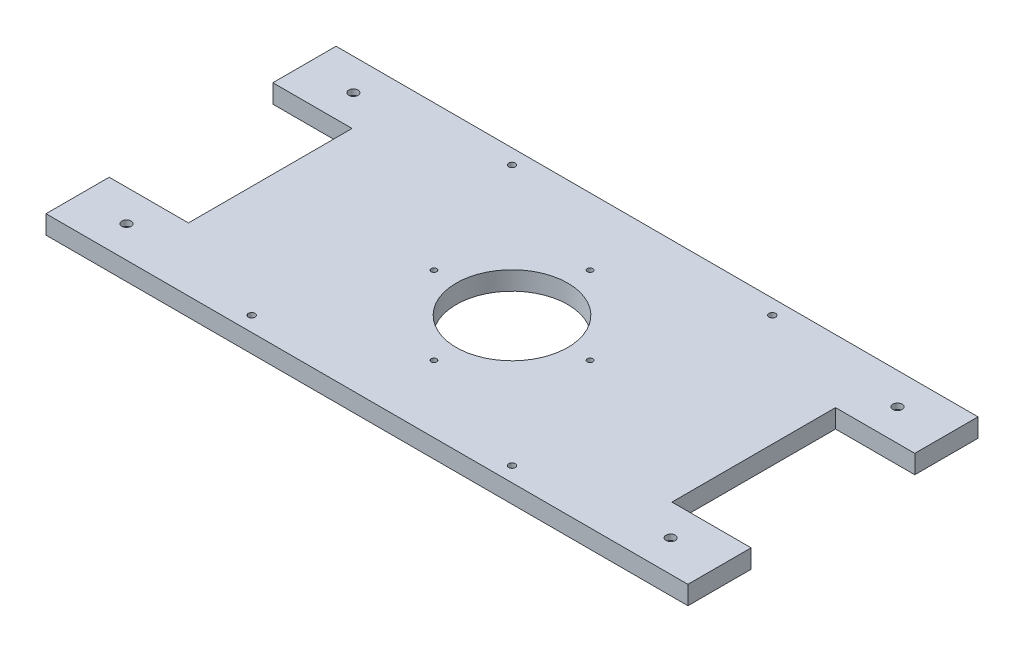
ISO-10303-21;
HEADER;
FILE_DESCRIPTION(('STEP AP214'),'2;1');
FILE_NAME('part.step','',(''),(''),'','','');
FILE_SCHEMA(('AUTOMOTIVE_DESIGN { 1 0 10303 214 1 1 1 1 }'));
ENDSEC;
DATA;
#1=APPLICATION_CONTEXT('core data for automotive mechanical design processes');
#2=APPLICATION_PROTOCOL_DEFINITION('international standard','automotive_design',2000,#1);
#3=PRODUCT_CONTEXT('',#1,'mechanical');
#4=PRODUCT('Part','Part','',(#3));
#5=PRODUCT_RELATED_PRODUCT_CATEGORY('part','',(#4));
#6=PRODUCT_DEFINITION_FORMATION('','',#4);
#7=PRODUCT_DEFINITION_CONTEXT('part definition',#1,'design');
#8=PRODUCT_DEFINITION('design','',#6,#7);
#9=PRODUCT_DEFINITION_SHAPE('','',#8);
#10=(LENGTH_UNIT() NAMED_UNIT(*) SI_UNIT(.MILLI.,.METRE.));
#11=(NAMED_UNIT(*) PLANE_ANGLE_UNIT() SI_UNIT($,.RADIAN.));
#12=(NAMED_UNIT(*) SI_UNIT($,.STERADIAN.) SOLID_ANGLE_UNIT());
#13=UNCERTAINTY_MEASURE_WITH_UNIT(LENGTH_MEASURE(1.E-05),#10,'distance_accuracy_value','');
#14=(GEOMETRIC_REPRESENTATION_CONTEXT(3) GLOBAL_UNCERTAINTY_ASSIGNED_CONTEXT((#13)) GLOBAL_UNIT_ASSIGNED_CONTEXT((#10,
#11,#12)) REPRESENTATION_CONTEXT('',''));
#15=CARTESIAN_POINT('',(0.,0.,0.));
#16=DIRECTION('',(0.,0.,1.));
#17=DIRECTION('',(1.,0.,0.));
#18=AXIS2_PLACEMENT_3D('',#15,#16,#17);
#19=CARTESIAN_POINT('',(-73.15,5.,-30.5));
#20=DIRECTION('',(0.,-1.,0.));
#21=DIRECTION('',(0.,0.,-1.));
#22=AXIS2_PLACEMENT_3D('',#19,#20,#21);
#23=CYLINDRICAL_SURFACE('',#22,1.25);
#24=CARTESIAN_POINT('',(-73.15,5.,-30.5));
#25=DIRECTION('',(0.,1.,0.));
#26=DIRECTION('',(0.,0.,1.));
#27=AXIS2_PLACEMENT_3D('',#24,#25,#26);
#28=CIRCLE('',#27,1.25);
#29=CARTESIAN_POINT('',(-73.15,5.,-29.25));
#30=VERTEX_POINT('',#29);
#31=EDGE_CURVE('E257',#30,#30,#28,.T.);
#32=ORIENTED_EDGE('',*,*,#31,.T.);
#33=EDGE_LOOP('',(#32));
#34=FACE_BOUND('',#33,.T.);
#35=CARTESIAN_POINT('',(-73.15,3.5,-30.5));
#36=DIRECTION('',(0.,-1.,0.));
#37=DIRECTION('',(0.,0.,-1.));
#38=AXIS2_PLACEMENT_3D('',#35,#36,#37);
#39=CIRCLE('',#38,1.25);
#40=CARTESIAN_POINT('',(-73.15,3.5,-31.75));
#41=VERTEX_POINT('',#40);
#42=EDGE_CURVE('E105',#41,#41,#39,.T.);
#43=ORIENTED_EDGE('',*,*,#42,.T.);
#44=EDGE_LOOP('',(#43));
#45=FACE_BOUND('',#44,.T.);
#46=ADVANCED_FACE('F101',(#34,#45),#23,.F.);
#47=CARTESIAN_POINT('',(73.15,5.,-30.5));
#48=DIRECTION('',(0.,-1.,0.));
#49=DIRECTION('',(0.,0.,-1.));
#50=AXIS2_PLACEMENT_3D('',#47,#48,#49);
#51=CYLINDRICAL_SURFACE('',#50,1.25);
#52=CARTESIAN_POINT('',(73.15,5.,-30.5));
#53=DIRECTION('',(0.,1.,0.));
#54=DIRECTION('',(0.,0.,1.));
#55=AXIS2_PLACEMENT_3D('',#52,#53,#54);
#56=CIRCLE('',#55,1.25);
#57=CARTESIAN_POINT('',(73.15,5.,-29.25));
#58=VERTEX_POINT('',#57);
#59=EDGE_CURVE('E254',#58,#58,#56,.T.);
#60=ORIENTED_EDGE('',*,*,#59,.T.);
#61=EDGE_LOOP('',(#60));
#62=FACE_BOUND('',#61,.T.);
#63=CARTESIAN_POINT('',(73.15,3.5,-30.5));
#64=DIRECTION('',(0.,-1.,0.));
#65=DIRECTION('',(0.,0.,-1.));
#66=AXIS2_PLACEMENT_3D('',#63,#64,#65);
#67=CIRCLE('',#66,1.25);
#68=CARTESIAN_POINT('',(73.15,3.5,-31.75));
#69=VERTEX_POINT('',#68);
#70=EDGE_CURVE('E298',#69,#69,#67,.T.);
#71=ORIENTED_EDGE('',*,*,#70,.T.);
#72=EDGE_LOOP('',(#71));
#73=FACE_BOUND('',#72,.T.);
#74=ADVANCED_FACE('F464',(#62,#73),#51,.F.);
#75=CARTESIAN_POINT('',(73.15,5.,30.5));
#76=DIRECTION('',(0.,-1.,0.));
#77=DIRECTION('',(0.,0.,-1.));
#78=AXIS2_PLACEMENT_3D('',#75,#76,#77);
#79=CYLINDRICAL_SURFACE('',#78,1.25);
#80=CARTESIAN_POINT('',(73.15,5.,30.5));
#81=DIRECTION('',(0.,1.,0.));
#82=DIRECTION('',(0.,0.,1.));
#83=AXIS2_PLACEMENT_3D('',#80,#81,#82);
#84=CIRCLE('',#83,1.25);
#85=CARTESIAN_POINT('',(73.15,5.,31.75));
#86=VERTEX_POINT('',#85);
#87=EDGE_CURVE('E251',#86,#86,#84,.T.);
#88=ORIENTED_EDGE('',*,*,#87,.T.);
#89=EDGE_LOOP('',(#88));
#90=FACE_BOUND('',#89,.T.);
#91=CARTESIAN_POINT('',(73.15,3.5,30.5));
#92=DIRECTION('',(0.,-1.,0.));
#93=DIRECTION('',(0.,0.,-1.));
#94=AXIS2_PLACEMENT_3D('',#91,#92,#93);
#95=CIRCLE('',#94,1.25);
#96=CARTESIAN_POINT('',(73.15,3.5,29.25));
#97=VERTEX_POINT('',#96);
#98=EDGE_CURVE('E296',#97,#97,#95,.T.);
#99=ORIENTED_EDGE('',*,*,#98,.T.);
#100=EDGE_LOOP('',(#99));
#101=FACE_BOUND('',#100,.T.);
#102=ADVANCED_FACE('F437',(#90,#101),#79,.F.);
#103=CARTESIAN_POINT('',(-73.15,5.,30.5));
#104=DIRECTION('',(0.,-1.,0.));
#105=DIRECTION('',(0.,0.,-1.));
#106=AXIS2_PLACEMENT_3D('',#103,#104,#105);
#107=CYLINDRICAL_SURFACE('',#106,1.25);
#108=CARTESIAN_POINT('',(-73.15,5.,30.5));
#109=DIRECTION('',(0.,1.,0.));
#110=DIRECTION('',(0.,0.,1.));
#111=AXIS2_PLACEMENT_3D('',#108,#109,#110);
#112=CIRCLE('',#111,1.25);
#113=CARTESIAN_POINT('',(-73.15,5.,31.75));
#114=VERTEX_POINT('',#113);
#115=EDGE_CURVE('E224',#114,#114,#112,.T.);
#116=ORIENTED_EDGE('',*,*,#115,.T.);
#117=EDGE_LOOP('',(#116));
#118=FACE_BOUND('',#117,.T.);
#119=CARTESIAN_POINT('',(-73.15,3.5,30.5));
#120=DIRECTION('',(0.,-1.,0.));
#121=DIRECTION('',(0.,0.,-1.));
#122=AXIS2_PLACEMENT_3D('',#119,#120,#121);
#123=CIRCLE('',#122,1.25);
#124=CARTESIAN_POINT('',(-73.15,3.5,29.25));
#125=VERTEX_POINT('',#124);
#126=EDGE_CURVE('E293',#125,#125,#123,.T.);
#127=ORIENTED_EDGE('',*,*,#126,.T.);
#128=EDGE_LOOP('',(#127));
#129=FACE_BOUND('',#128,.T.);
#130=ADVANCED_FACE('F433',(#118,#129),#107,.F.);
#131=CARTESIAN_POINT('',(-86.3,5.,39.));
#132=DIRECTION('',(-1.,0.,0.));
#133=DIRECTION('',(0.,0.,1.));
#134=AXIS2_PLACEMENT_3D('',#131,#132,#133);
#135=PLANE('',#134);
#136=DIRECTION('',(0.,0.,-1.));
#137=VECTOR('',#136,1.);
#138=CARTESIAN_POINT('',(-86.3,0.,39.));
#139=LINE('',#138,#137);
#140=CARTESIAN_POINT('',(-86.3,0.,-22.));
#141=VERTEX_POINT('',#140);
#142=CARTESIAN_POINT('',(-86.3,0.,-39.));
#143=VERTEX_POINT('',#142);
#144=EDGE_CURVE('E260',#141,#143,#139,.T.);
#145=ORIENTED_EDGE('',*,*,#144,.F.);
#146=DIRECTION('',(0.,1.,0.));
#147=VECTOR('',#146,1.);
#148=CARTESIAN_POINT('',(-86.3,0.,-22.));
#149=LINE('',#148,#147);
#150=CARTESIAN_POINT('',(-86.3,5.,-22.));
#151=VERTEX_POINT('',#150);
#152=EDGE_CURVE('E194',#141,#151,#149,.T.);
#153=ORIENTED_EDGE('',*,*,#152,.T.);
#154=DIRECTION('',(0.,0.,-1.));
#155=VECTOR('',#154,1.);
#156=CARTESIAN_POINT('',(-86.3,5.,39.));
#157=LINE('',#156,#155);
#158=CARTESIAN_POINT('',(-86.3,5.,-39.));
#159=VERTEX_POINT('',#158);
#160=EDGE_CURVE('E265',#151,#159,#157,.T.);
#161=ORIENTED_EDGE('',*,*,#160,.T.);
#162=DIRECTION('',(0.,-1.,0.));
#163=VECTOR('',#162,1.);
#164=CARTESIAN_POINT('',(-86.3,5.,-39.));
#165=LINE('',#164,#163);
#166=EDGE_CURVE('E274',#159,#143,#165,.T.);
#167=ORIENTED_EDGE('',*,*,#166,.T.);
#168=EDGE_LOOP('',(#145,#153,#161,#167));
#169=FACE_BOUND('',#168,.T.);
#170=ADVANCED_FACE('F436',(#169),#135,.T.);
#171=CARTESIAN_POINT('',(86.3,5.,39.));
#172=DIRECTION('',(-1.,0.,0.));
#173=DIRECTION('',(0.,0.,1.));
#174=AXIS2_PLACEMENT_3D('',#171,#172,#173);
#175=PLANE('',#174);
#176=DIRECTION('',(0.,1.,0.));
#177=VECTOR('',#176,1.);
#178=CARTESIAN_POINT('',(86.3,0.,22.));
#179=LINE('',#178,#177);
#180=CARTESIAN_POINT('',(86.3,0.,22.));
#181=VERTEX_POINT('',#180);
#182=CARTESIAN_POINT('',(86.3,5.,22.));
#183=VERTEX_POINT('',#182);
#184=EDGE_CURVE('E246',#181,#183,#179,.T.);
#185=ORIENTED_EDGE('',*,*,#184,.T.);
#186=DIRECTION('',(0.,0.,-1.));
#187=VECTOR('',#186,1.);
#188=CARTESIAN_POINT('',(86.3,5.,39.));
#189=LINE('',#188,#187);
#190=CARTESIAN_POINT('',(86.3,5.,39.));
#191=VERTEX_POINT('',#190);
#192=EDGE_CURVE('E269',#191,#183,#189,.T.);
#193=ORIENTED_EDGE('',*,*,#192,.F.);
#194=DIRECTION('',(0.,-1.,0.));
#195=VECTOR('',#194,1.);
#196=CARTESIAN_POINT('',(86.3,5.,39.));
#197=LINE('',#196,#195);
#198=CARTESIAN_POINT('',(86.3,0.,39.));
#199=VERTEX_POINT('',#198);
#200=EDGE_CURVE('E110',#191,#199,#197,.T.);
#201=ORIENTED_EDGE('',*,*,#200,.T.);
#202=DIRECTION('',(0.,0.,-1.));
#203=VECTOR('',#202,1.);
#204=CARTESIAN_POINT('',(86.3,0.,39.));
#205=LINE('',#204,#203);
#206=EDGE_CURVE('E281',#199,#181,#205,.T.);
#207=ORIENTED_EDGE('',*,*,#206,.T.);
#208=EDGE_LOOP('',(#185,#193,#201,#207));
#209=FACE_BOUND('',#208,.T.);
#210=ADVANCED_FACE('F405',(#209),#175,.F.);
#211=CARTESIAN_POINT('',(0.,5.,0.));
#212=DIRECTION('',(0.,-1.,0.));
#213=DIRECTION('',(0.,0.,-1.));
#214=AXIS2_PLACEMENT_3D('',#211,#212,#213);
#215=PLANE('',#214);
#216=CARTESIAN_POINT('',(0.,5.,-21.0000000000013));
#217=DIRECTION('',(0.,1.,0.));
#218=DIRECTION('',(0.,0.,1.));
#219=AXIS2_PLACEMENT_3D('',#216,#217,#218);
#220=CIRCLE('',#219,0.75);
#221=CARTESIAN_POINT('',(0.,5.,-20.2500000000013));
#222=VERTEX_POINT('',#221);
#223=EDGE_CURVE('E387',#222,#222,#220,.T.);
#224=ORIENTED_EDGE('',*,*,#223,.F.);
#225=EDGE_LOOP('',(#224));
#226=FACE_BOUND('',#225,.T.);
#227=CARTESIAN_POINT('',(21.0000000000013,5.,0.));
#228=DIRECTION('',(0.,1.,0.));
#229=DIRECTION('',(0.,0.,1.));
#230=AXIS2_PLACEMENT_3D('',#227,#228,#229);
#231=CIRCLE('',#230,0.750000000000002);
#232=CARTESIAN_POINT('',(21.0000000000013,5.,0.749999999999999));
#233=VERTEX_POINT('',#232);
#234=EDGE_CURVE('E384',#233,#233,#231,.T.);
#235=ORIENTED_EDGE('',*,*,#234,.F.);
#236=EDGE_LOOP('',(#235));
#237=FACE_BOUND('',#236,.T.);
#238=CARTESIAN_POINT('',(-21.0000000000013,5.,0.));
#239=DIRECTION('',(0.,1.,0.));
#240=DIRECTION('',(0.,0.,1.));
#241=AXIS2_PLACEMENT_3D('',#238,#239,#240);
#242=CIRCLE('',#241,0.750000000000002);
#243=CARTESIAN_POINT('',(-21.0000000000013,5.,0.750000000000003));
#244=VERTEX_POINT('',#243);
#245=EDGE_CURVE('E378',#244,#244,#242,.T.);
#246=ORIENTED_EDGE('',*,*,#245,.F.);
#247=EDGE_LOOP('',(#246));
#248=FACE_BOUND('',#247,.T.);
#249=CARTESIAN_POINT('',(0.,5.,21.0000000000013));
#250=DIRECTION('',(0.,1.,0.));
#251=DIRECTION('',(0.,0.,1.));
#252=AXIS2_PLACEMENT_3D('',#249,#250,#251);
#253=CIRCLE('',#252,0.75);
#254=CARTESIAN_POINT('',(0.,5.,21.7500000000013));
#255=VERTEX_POINT('',#254);
#256=EDGE_CURVE('E372',#255,#255,#253,.T.);
#257=ORIENTED_EDGE('',*,*,#256,.F.);
#258=EDGE_LOOP('',(#257));
#259=FACE_BOUND('',#258,.T.);
#260=CARTESIAN_POINT('',(0.,5.,0.));
#261=DIRECTION('',(0.,-1.,0.));
#262=DIRECTION('',(0.,0.,-1.));
#263=AXIS2_PLACEMENT_3D('',#260,#261,#262);
#264=CIRCLE('',#263,15.);
#265=CARTESIAN_POINT('',(0.,5.,-15.));
#266=VERTEX_POINT('',#265);
#267=EDGE_CURVE('E360',#266,#266,#264,.T.);
#268=ORIENTED_EDGE('',*,*,#267,.T.);
#269=EDGE_LOOP('',(#268));
#270=FACE_BOUND('',#269,.T.);
#271=CARTESIAN_POINT('',(35.,5.,-35.));
#272=DIRECTION('',(0.,1.,0.));
#273=DIRECTION('',(0.,0.,1.));
#274=AXIS2_PLACEMENT_3D('',#271,#272,#273);
#275=CIRCLE('',#274,0.899999999999996);
#276=CARTESIAN_POINT('',(35.,5.,-34.1));
#277=VERTEX_POINT('',#276);
#278=EDGE_CURVE('E342',#277,#277,#275,.T.);
#279=ORIENTED_EDGE('',*,*,#278,.F.);
#280=EDGE_LOOP('',(#279));
#281=FACE_BOUND('',#280,.T.);
#282=CARTESIAN_POINT('',(-35.,5.,35.));
#283=DIRECTION('',(0.,1.,0.));
#284=DIRECTION('',(0.,0.,1.));
#285=AXIS2_PLACEMENT_3D('',#282,#283,#284);
#286=CIRCLE('',#285,0.899999999999996);
#287=CARTESIAN_POINT('',(-35.,5.,35.9));
#288=VERTEX_POINT('',#287);
#289=EDGE_CURVE('E348',#288,#288,#286,.T.);
#290=ORIENTED_EDGE('',*,*,#289,.F.);
#291=EDGE_LOOP('',(#290));
#292=FACE_BOUND('',#291,.T.);
#293=CARTESIAN_POINT('',(35.,5.,35.));
#294=DIRECTION('',(0.,1.,0.));
#295=DIRECTION('',(0.,0.,1.));
#296=AXIS2_PLACEMENT_3D('',#293,#294,#295);
#297=CIRCLE('',#296,0.899999999999996);
#298=CARTESIAN_POINT('',(35.,5.,35.9));
#299=VERTEX_POINT('',#298);
#300=EDGE_CURVE('E349',#299,#299,#297,.T.);
#301=ORIENTED_EDGE('',*,*,#300,.F.);
#302=EDGE_LOOP('',(#301));
#303=FACE_BOUND('',#302,.T.);
#304=CARTESIAN_POINT('',(-35.,5.,-35.));
#305=DIRECTION('',(0.,1.,0.));
#306=DIRECTION('',(0.,0.,1.));
#307=AXIS2_PLACEMENT_3D('',#304,#305,#306);
#308=CIRCLE('',#307,0.899999999999996);
#309=CARTESIAN_POINT('',(-35.,5.,-34.1));
#310=VERTEX_POINT('',#309);
#311=EDGE_CURVE('E339',#310,#310,#308,.T.);
#312=ORIENTED_EDGE('',*,*,#311,.F.);
#313=EDGE_LOOP('',(#312));
#314=FACE_BOUND('',#313,.T.);
#315=DIRECTION('',(0.,0.,1.));
#316=VECTOR('',#315,1.);
#317=CARTESIAN_POINT('',(-65.,5.,0.));
#318=LINE('',#317,#316);
#319=CARTESIAN_POINT('',(-65.,5.,-22.));
#320=VERTEX_POINT('',#319);
#321=CARTESIAN_POINT('',(-65.,5.,22.));
#322=VERTEX_POINT('',#321);
#323=EDGE_CURVE('E205',#320,#322,#318,.T.);
#324=ORIENTED_EDGE('',*,*,#323,.T.);
#325=DIRECTION('',(1.,0.,0.));
#326=VECTOR('',#325,1.);
#327=CARTESIAN_POINT('',(0.,5.,22.0000000000001));
#328=LINE('',#327,#326);
#329=CARTESIAN_POINT('',(-86.3,5.,22.));
#330=VERTEX_POINT('',#329);
#331=EDGE_CURVE('E210',#330,#322,#328,.T.);
#332=ORIENTED_EDGE('',*,*,#331,.F.);
#333=CARTESIAN_POINT('',(-86.3,5.,39.));
#334=VERTEX_POINT('',#333);
#335=EDGE_CURVE('E261',#334,#330,#157,.T.);
#336=ORIENTED_EDGE('',*,*,#335,.F.);
#337=DIRECTION('',(1.,0.,0.));
#338=VECTOR('',#337,1.);
#339=CARTESIAN_POINT('',(-86.3,5.,39.));
#340=LINE('',#339,#338);
#341=EDGE_CURVE('E272',#334,#191,#340,.T.);
#342=ORIENTED_EDGE('',*,*,#341,.T.);
#343=ORIENTED_EDGE('',*,*,#192,.T.);
#344=DIRECTION('',(-1.,0.,0.));
#345=VECTOR('',#344,1.);
#346=CARTESIAN_POINT('',(0.,5.,22.));
#347=LINE('',#346,#345);
#348=CARTESIAN_POINT('',(65.0000000000001,5.,22.));
#349=VERTEX_POINT('',#348);
#350=EDGE_CURVE('E126',#183,#349,#347,.T.);
#351=ORIENTED_EDGE('',*,*,#350,.T.);
#352=DIRECTION('',(0.,0.,-1.));
#353=VECTOR('',#352,1.);
#354=CARTESIAN_POINT('',(65.0000000000001,5.,0.));
#355=LINE('',#354,#353);
#356=CARTESIAN_POINT('',(65.0000000000001,5.,-22.));
#357=VERTEX_POINT('',#356);
#358=EDGE_CURVE('E237',#349,#357,#355,.T.);
#359=ORIENTED_EDGE('',*,*,#358,.T.);
#360=DIRECTION('',(-1.,0.,0.));
#361=VECTOR('',#360,1.);
#362=CARTESIAN_POINT('',(0.,5.,-22.));
#363=LINE('',#362,#361);
#364=CARTESIAN_POINT('',(86.3,5.,-22.));
#365=VERTEX_POINT('',#364);
#366=EDGE_CURVE('E231',#365,#357,#363,.T.);
#367=ORIENTED_EDGE('',*,*,#366,.F.);
#368=CARTESIAN_POINT('',(86.3,5.,-39.));
#369=VERTEX_POINT('',#368);
#370=EDGE_CURVE('E268',#365,#369,#189,.T.);
#371=ORIENTED_EDGE('',*,*,#370,.T.);
#372=DIRECTION('',(1.,0.,0.));
#373=VECTOR('',#372,1.);
#374=CARTESIAN_POINT('',(-86.3,5.,-39.));
#375=LINE('',#374,#373);
#376=EDGE_CURVE('E264',#159,#369,#375,.T.);
#377=ORIENTED_EDGE('',*,*,#376,.F.);
#378=ORIENTED_EDGE('',*,*,#160,.F.);
#379=DIRECTION('',(1.,0.,0.));
#380=VECTOR('',#379,1.);
#381=CARTESIAN_POINT('',(0.,5.,-22.));
#382=LINE('',#381,#380);
#383=EDGE_CURVE('E118',#151,#320,#382,.T.);
#384=ORIENTED_EDGE('',*,*,#383,.T.);
#385=EDGE_LOOP('',(#324,#332,#336,#342,#343,#351,#359,#367,#371,#377,#378,#384));
#386=FACE_BOUND('',#385,.T.);
#387=ORIENTED_EDGE('',*,*,#31,.F.);
#388=EDGE_LOOP('',(#387));
#389=FACE_BOUND('',#388,.T.);
#390=ORIENTED_EDGE('',*,*,#59,.F.);
#391=EDGE_LOOP('',(#390));
#392=FACE_BOUND('',#391,.T.);
#393=ORIENTED_EDGE('',*,*,#87,.F.);
#394=EDGE_LOOP('',(#393));
#395=FACE_BOUND('',#394,.T.);
#396=ORIENTED_EDGE('',*,*,#115,.F.);
#397=EDGE_LOOP('',(#396));
#398=FACE_BOUND('',#397,.T.);
#399=ADVANCED_FACE('F402',(#226,#237,#248,#259,#270,#281,#292,#303,#314,#386,#389,#392,#395,
#398),#215,.F.);
#400=CARTESIAN_POINT('',(0.,0.,0.));
#401=DIRECTION('',(0.,-1.,0.));
#402=DIRECTION('',(0.,0.,-1.));
#403=AXIS2_PLACEMENT_3D('',#400,#401,#402);
#404=PLANE('',#403);
#405=CARTESIAN_POINT('',(0.,0.,-21.0000000000013));
#406=DIRECTION('',(0.,1.,0.));
#407=DIRECTION('',(0.,0.,1.));
#408=AXIS2_PLACEMENT_3D('',#405,#406,#407);
#409=CIRCLE('',#408,0.75);
#410=CARTESIAN_POINT('',(0.,0.,-20.2500000000013));
#411=VERTEX_POINT('',#410);
#412=EDGE_CURVE('E366',#411,#411,#409,.T.);
#413=ORIENTED_EDGE('',*,*,#412,.T.);
#414=EDGE_LOOP('',(#413));
#415=FACE_BOUND('',#414,.T.);
#416=CARTESIAN_POINT('',(21.0000000000013,0.,0.));
#417=DIRECTION('',(0.,1.,0.));
#418=DIRECTION('',(0.,0.,1.));
#419=AXIS2_PLACEMENT_3D('',#416,#417,#418);
#420=CIRCLE('',#419,0.750000000000002);
#421=CARTESIAN_POINT('',(21.0000000000013,0.,0.749999999999999));
#422=VERTEX_POINT('',#421);
#423=EDGE_CURVE('E381',#422,#422,#420,.T.);
#424=ORIENTED_EDGE('',*,*,#423,.T.);
#425=EDGE_LOOP('',(#424));
#426=FACE_BOUND('',#425,.T.);
#427=CARTESIAN_POINT('',(-21.0000000000013,0.,0.));
#428=DIRECTION('',(0.,1.,0.));
#429=DIRECTION('',(0.,0.,1.));
#430=AXIS2_PLACEMENT_3D('',#427,#428,#429);
#431=CIRCLE('',#430,0.750000000000002);
#432=CARTESIAN_POINT('',(-21.0000000000013,0.,0.750000000000003));
#433=VERTEX_POINT('',#432);
#434=EDGE_CURVE('E375',#433,#433,#431,.T.);
#435=ORIENTED_EDGE('',*,*,#434,.T.);
#436=EDGE_LOOP('',(#435));
#437=FACE_BOUND('',#436,.T.);
#438=CARTESIAN_POINT('',(0.,0.,21.0000000000013));
#439=DIRECTION('',(0.,1.,0.));
#440=DIRECTION('',(0.,0.,1.));
#441=AXIS2_PLACEMENT_3D('',#438,#439,#440);
#442=CIRCLE('',#441,0.75);
#443=CARTESIAN_POINT('',(0.,0.,21.7500000000013));
#444=VERTEX_POINT('',#443);
#445=EDGE_CURVE('E369',#444,#444,#442,.T.);
#446=ORIENTED_EDGE('',*,*,#445,.T.);
#447=EDGE_LOOP('',(#446));
#448=FACE_BOUND('',#447,.T.);
#449=CARTESIAN_POINT('',(0.,0.,0.));
#450=DIRECTION('',(0.,-1.,0.));
#451=DIRECTION('',(0.,0.,-1.));
#452=AXIS2_PLACEMENT_3D('',#449,#450,#451);
#453=CIRCLE('',#452,15.);
#454=CARTESIAN_POINT('',(0.,0.,-15.));
#455=VERTEX_POINT('',#454);
#456=EDGE_CURVE('E363',#455,#455,#453,.T.);
#457=ORIENTED_EDGE('',*,*,#456,.F.);
#458=EDGE_LOOP('',(#457));
#459=FACE_BOUND('',#458,.T.);
#460=CARTESIAN_POINT('',(35.,0.,-35.));
#461=DIRECTION('',(0.,1.,0.));
#462=DIRECTION('',(0.,0.,1.));
#463=AXIS2_PLACEMENT_3D('',#460,#461,#462);
#464=CIRCLE('',#463,0.899999999999996);
#465=CARTESIAN_POINT('',(35.,0.,-34.1));
#466=VERTEX_POINT('',#465);
#467=EDGE_CURVE('E352',#466,#466,#464,.T.);
#468=ORIENTED_EDGE('',*,*,#467,.T.);
#469=EDGE_LOOP('',(#468));
#470=FACE_BOUND('',#469,.T.);
#471=CARTESIAN_POINT('',(-35.,0.,35.));
#472=DIRECTION('',(0.,1.,0.));
#473=DIRECTION('',(0.,0.,1.));
#474=AXIS2_PLACEMENT_3D('',#471,#472,#473);
#475=CIRCLE('',#474,0.899999999999996);
#476=CARTESIAN_POINT('',(-35.,0.,35.9));
#477=VERTEX_POINT('',#476);
#478=EDGE_CURVE('E345',#477,#477,#475,.T.);
#479=ORIENTED_EDGE('',*,*,#478,.T.);
#480=EDGE_LOOP('',(#479));
#481=FACE_BOUND('',#480,.T.);
#482=CARTESIAN_POINT('',(35.,0.,35.));
#483=DIRECTION('',(0.,1.,0.));
#484=DIRECTION('',(0.,0.,1.));
#485=AXIS2_PLACEMENT_3D('',#482,#483,#484);
#486=CIRCLE('',#485,0.899999999999996);
#487=CARTESIAN_POINT('',(35.,0.,35.9));
#488=VERTEX_POINT('',#487);
#489=EDGE_CURVE('E357',#488,#488,#486,.T.);
#490=ORIENTED_EDGE('',*,*,#489,.T.);
#491=EDGE_LOOP('',(#490));
#492=FACE_BOUND('',#491,.T.);
#493=CARTESIAN_POINT('',(-35.,0.,-35.));
#494=DIRECTION('',(0.,1.,0.));
#495=DIRECTION('',(0.,0.,1.));
#496=AXIS2_PLACEMENT_3D('',#493,#494,#495);
#497=CIRCLE('',#496,0.899999999999996);
#498=CARTESIAN_POINT('',(-35.,0.,-34.1));
#499=VERTEX_POINT('',#498);
#500=EDGE_CURVE('E331',#499,#499,#497,.T.);
#501=ORIENTED_EDGE('',*,*,#500,.T.);
#502=EDGE_LOOP('',(#501));
#503=FACE_BOUND('',#502,.T.);
#504=CARTESIAN_POINT('',(73.15,0.,-30.5));
#505=DIRECTION('',(0.,1.,0.));
#506=DIRECTION('',(0.,0.,1.));
#507=AXIS2_PLACEMENT_3D('',#504,#505,#506);
#508=CIRCLE('',#507,2.);
#509=CARTESIAN_POINT('',(73.15,0.,-28.5));
#510=VERTEX_POINT('',#509);
#511=EDGE_CURVE('E324',#510,#510,#508,.T.);
#512=ORIENTED_EDGE('',*,*,#511,.T.);
#513=EDGE_LOOP('',(#512));
#514=FACE_BOUND('',#513,.T.);
#515=CARTESIAN_POINT('',(73.15,0.,30.5));
#516=DIRECTION('',(0.,1.,0.));
#517=DIRECTION('',(0.,0.,1.));
#518=AXIS2_PLACEMENT_3D('',#515,#516,#517);
#519=CIRCLE('',#518,2.);
#520=CARTESIAN_POINT('',(73.15,0.,32.5));
#521=VERTEX_POINT('',#520);
#522=EDGE_CURVE('E332',#521,#521,#519,.T.);
#523=ORIENTED_EDGE('',*,*,#522,.T.);
#524=EDGE_LOOP('',(#523));
#525=FACE_BOUND('',#524,.T.);
#526=CARTESIAN_POINT('',(-73.15,0.,30.5));
#527=DIRECTION('',(0.,1.,0.));
#528=DIRECTION('',(0.,0.,1.));
#529=AXIS2_PLACEMENT_3D('',#526,#527,#528);
#530=CIRCLE('',#529,2.);
#531=CARTESIAN_POINT('',(-73.15,0.,32.5));
#532=VERTEX_POINT('',#531);
#533=EDGE_CURVE('E317',#532,#532,#530,.T.);
#534=ORIENTED_EDGE('',*,*,#533,.T.);
#535=EDGE_LOOP('',(#534));
#536=FACE_BOUND('',#535,.T.);
#537=CARTESIAN_POINT('',(-73.15,0.,-30.5));
#538=DIRECTION('',(0.,1.,0.));
#539=DIRECTION('',(0.,0.,1.));
#540=AXIS2_PLACEMENT_3D('',#537,#538,#539);
#541=CIRCLE('',#540,2.);
#542=CARTESIAN_POINT('',(-73.15,0.,-28.5));
#543=VERTEX_POINT('',#542);
#544=EDGE_CURVE('E315',#543,#543,#541,.T.);
#545=ORIENTED_EDGE('',*,*,#544,.T.);
#546=EDGE_LOOP('',(#545));
#547=FACE_BOUND('',#546,.T.);
#548=DIRECTION('',(1.,0.,0.));
#549=VECTOR('',#548,1.);
#550=CARTESIAN_POINT('',(0.,0.,22.0000000000001));
#551=LINE('',#550,#549);
#552=CARTESIAN_POINT('',(-86.3,0.,22.));
#553=VERTEX_POINT('',#552);
#554=CARTESIAN_POINT('',(-65.,0.,22.));
#555=VERTEX_POINT('',#554);
#556=EDGE_CURVE('E198',#553,#555,#551,.T.);
#557=ORIENTED_EDGE('',*,*,#556,.T.);
#558=DIRECTION('',(0.,0.,1.));
#559=VECTOR('',#558,1.);
#560=CARTESIAN_POINT('',(-65.,0.,0.));
#561=LINE('',#560,#559);
#562=CARTESIAN_POINT('',(-65.,0.,-22.));
#563=VERTEX_POINT('',#562);
#564=EDGE_CURVE('E199',#563,#555,#561,.T.);
#565=ORIENTED_EDGE('',*,*,#564,.F.);
#566=DIRECTION('',(1.,0.,0.));
#567=VECTOR('',#566,1.);
#568=CARTESIAN_POINT('',(0.,0.,-22.));
#569=LINE('',#568,#567);
#570=EDGE_CURVE('E189',#141,#563,#569,.T.);
#571=ORIENTED_EDGE('',*,*,#570,.F.);
#572=ORIENTED_EDGE('',*,*,#144,.T.);
#573=DIRECTION('',(1.,0.,0.));
#574=VECTOR('',#573,1.);
#575=CARTESIAN_POINT('',(-86.3,0.,-39.));
#576=LINE('',#575,#574);
#577=CARTESIAN_POINT('',(86.3,0.,-39.));
#578=VERTEX_POINT('',#577);
#579=EDGE_CURVE('E277',#143,#578,#576,.T.);
#580=ORIENTED_EDGE('',*,*,#579,.T.);
#581=CARTESIAN_POINT('',(86.3,0.,-22.));
#582=VERTEX_POINT('',#581);
#583=EDGE_CURVE('E280',#582,#578,#205,.T.);
#584=ORIENTED_EDGE('',*,*,#583,.F.);
#585=DIRECTION('',(-1.,0.,0.));
#586=VECTOR('',#585,1.);
#587=CARTESIAN_POINT('',(0.,0.,-22.));
#588=LINE('',#587,#586);
#589=CARTESIAN_POINT('',(65.0000000000001,0.,-22.));
#590=VERTEX_POINT('',#589);
#591=EDGE_CURVE('E233',#582,#590,#588,.T.);
#592=ORIENTED_EDGE('',*,*,#591,.T.);
#593=DIRECTION('',(0.,0.,-1.));
#594=VECTOR('',#593,1.);
#595=CARTESIAN_POINT('',(65.0000000000001,0.,0.));
#596=LINE('',#595,#594);
#597=CARTESIAN_POINT('',(65.0000000000001,0.,22.));
#598=VERTEX_POINT('',#597);
#599=EDGE_CURVE('E228',#598,#590,#596,.T.);
#600=ORIENTED_EDGE('',*,*,#599,.F.);
#601=DIRECTION('',(-1.,0.,0.));
#602=VECTOR('',#601,1.);
#603=CARTESIAN_POINT('',(0.,0.,22.));
#604=LINE('',#603,#602);
#605=EDGE_CURVE('E230',#181,#598,#604,.T.);
#606=ORIENTED_EDGE('',*,*,#605,.F.);
#607=ORIENTED_EDGE('',*,*,#206,.F.);
#608=DIRECTION('',(1.,0.,0.));
#609=VECTOR('',#608,1.);
#610=CARTESIAN_POINT('',(-86.3,0.,39.));
#611=LINE('',#610,#609);
#612=CARTESIAN_POINT('',(-86.3,0.,39.));
#613=VERTEX_POINT('',#612);
#614=EDGE_CURVE('E284',#613,#199,#611,.T.);
#615=ORIENTED_EDGE('',*,*,#614,.F.);
#616=EDGE_CURVE('E275',#613,#553,#139,.T.);
#617=ORIENTED_EDGE('',*,*,#616,.T.);
#618=EDGE_LOOP('',(#557,#565,#571,#572,#580,#584,#592,#600,#606,#607,#615,#617));
#619=FACE_BOUND('',#618,.T.);
#620=ADVANCED_FACE('F208',(#415,#426,#437,#448,#459,#470,#481,#492,#503,#514,#525,#536,#547,
#619),#404,.T.);
#621=DIRECTION('',(0.,1.,0.));
#622=VECTOR('',#621,1.);
#623=CARTESIAN_POINT('',(-86.3,0.,22.));
#624=LINE('',#623,#622);
#625=EDGE_CURVE('E225',#553,#330,#624,.T.);
#626=ORIENTED_EDGE('',*,*,#625,.F.);
#627=ORIENTED_EDGE('',*,*,#616,.F.);
#628=DIRECTION('',(0.,-1.,0.));
#629=VECTOR('',#628,1.);
#630=CARTESIAN_POINT('',(-86.3,5.,39.));
#631=LINE('',#630,#629);
#632=EDGE_CURVE('E13',#334,#613,#631,.T.);
#633=ORIENTED_EDGE('',*,*,#632,.F.);
#634=ORIENTED_EDGE('',*,*,#335,.T.);
#635=EDGE_LOOP('',(#626,#627,#633,#634));
#636=FACE_BOUND('',#635,.T.);
#637=ADVANCED_FACE('F103',(#636),#135,.T.);
#638=CARTESIAN_POINT('',(-86.3,5.,39.));
#639=DIRECTION('',(0.,0.,-1.));
#640=DIRECTION('',(-1.,0.,0.));
#641=AXIS2_PLACEMENT_3D('',#638,#639,#640);
#642=PLANE('',#641);
#643=ORIENTED_EDGE('',*,*,#614,.T.);
#644=ORIENTED_EDGE('',*,*,#200,.F.);
#645=ORIENTED_EDGE('',*,*,#341,.F.);
#646=ORIENTED_EDGE('',*,*,#632,.T.);
#647=EDGE_LOOP('',(#643,#644,#645,#646));
#648=FACE_BOUND('',#647,.T.);
#649=ADVANCED_FACE('F460',(#648),#642,.F.);
#650=ORIENTED_EDGE('',*,*,#370,.F.);
#651=DIRECTION('',(0.,1.,0.));
#652=VECTOR('',#651,1.);
#653=CARTESIAN_POINT('',(86.3,0.,-22.));
#654=LINE('',#653,#652);
#655=EDGE_CURVE('E244',#582,#365,#654,.T.);
#656=ORIENTED_EDGE('',*,*,#655,.F.);
#657=ORIENTED_EDGE('',*,*,#583,.T.);
#658=DIRECTION('',(0.,-1.,0.));
#659=VECTOR('',#658,1.);
#660=CARTESIAN_POINT('',(86.3,5.,-39.));
#661=LINE('',#660,#659);
#662=EDGE_CURVE('E288',#369,#578,#661,.T.);
#663=ORIENTED_EDGE('',*,*,#662,.F.);
#664=EDGE_LOOP('',(#650,#656,#657,#663));
#665=FACE_BOUND('',#664,.T.);
#666=ADVANCED_FACE('F774',(#665),#175,.F.);
#667=CARTESIAN_POINT('',(-86.3,5.,-39.));
#668=DIRECTION('',(0.,0.,-1.));
#669=DIRECTION('',(-1.,0.,0.));
#670=AXIS2_PLACEMENT_3D('',#667,#668,#669);
#671=PLANE('',#670);
#672=ORIENTED_EDGE('',*,*,#579,.F.);
#673=ORIENTED_EDGE('',*,*,#166,.F.);
#674=ORIENTED_EDGE('',*,*,#376,.T.);
#675=ORIENTED_EDGE('',*,*,#662,.T.);
#676=EDGE_LOOP('',(#672,#673,#674,#675));
#677=FACE_BOUND('',#676,.T.);
#678=ADVANCED_FACE('F480',(#677),#671,.T.);
#679=CARTESIAN_POINT('',(65.0000000000001,0.,0.));
#680=DIRECTION('',(1.,0.,0.));
#681=DIRECTION('',(0.,0.,-1.));
#682=AXIS2_PLACEMENT_3D('',#679,#680,#681);
#683=PLANE('',#682);
#684=ORIENTED_EDGE('',*,*,#358,.F.);
#685=DIRECTION('',(0.,1.,0.));
#686=VECTOR('',#685,1.);
#687=CARTESIAN_POINT('',(65.0000000000001,0.,22.));
#688=LINE('',#687,#686);
#689=EDGE_CURVE('E236',#598,#349,#688,.T.);
#690=ORIENTED_EDGE('',*,*,#689,.F.);
#691=ORIENTED_EDGE('',*,*,#599,.T.);
#692=DIRECTION('',(0.,1.,0.));
#693=VECTOR('',#692,1.);
#694=CARTESIAN_POINT('',(65.0000000000001,0.,-22.));
#695=LINE('',#694,#693);
#696=EDGE_CURVE('E220',#590,#357,#695,.T.);
#697=ORIENTED_EDGE('',*,*,#696,.T.);
#698=EDGE_LOOP('',(#684,#690,#691,#697));
#699=FACE_BOUND('',#698,.T.);
#700=ADVANCED_FACE('F476',(#699),#683,.T.);
#701=CARTESIAN_POINT('',(0.,0.,-22.));
#702=DIRECTION('',(0.,0.,-1.));
#703=DIRECTION('',(-1.,0.,0.));
#704=AXIS2_PLACEMENT_3D('',#701,#702,#703);
#705=PLANE('',#704);
#706=ORIENTED_EDGE('',*,*,#366,.T.);
#707=ORIENTED_EDGE('',*,*,#696,.F.);
#708=ORIENTED_EDGE('',*,*,#591,.F.);
#709=ORIENTED_EDGE('',*,*,#655,.T.);
#710=EDGE_LOOP('',(#706,#707,#708,#709));
#711=FACE_BOUND('',#710,.T.);
#712=ADVANCED_FACE('F479',(#711),#705,.F.);
#713=CARTESIAN_POINT('',(0.,0.,22.));
#714=DIRECTION('',(0.,0.,-1.));
#715=DIRECTION('',(-1.,0.,0.));
#716=AXIS2_PLACEMENT_3D('',#713,#714,#715);
#717=PLANE('',#716);
#718=ORIENTED_EDGE('',*,*,#350,.F.);
#719=ORIENTED_EDGE('',*,*,#184,.F.);
#720=ORIENTED_EDGE('',*,*,#605,.T.);
#721=ORIENTED_EDGE('',*,*,#689,.T.);
#722=EDGE_LOOP('',(#718,#719,#720,#721));
#723=FACE_BOUND('',#722,.T.);
#724=ADVANCED_FACE('F482',(#723),#717,.T.);
#725=CARTESIAN_POINT('',(-65.,0.,0.));
#726=DIRECTION('',(-1.,0.,0.));
#727=DIRECTION('',(0.,0.,1.));
#728=AXIS2_PLACEMENT_3D('',#725,#726,#727);
#729=PLANE('',#728);
#730=ORIENTED_EDGE('',*,*,#323,.F.);
#731=DIRECTION('',(0.,1.,0.));
#732=VECTOR('',#731,1.);
#733=CARTESIAN_POINT('',(-65.,0.,-22.));
#734=LINE('',#733,#732);
#735=EDGE_CURVE('E192',#563,#320,#734,.T.);
#736=ORIENTED_EDGE('',*,*,#735,.F.);
#737=ORIENTED_EDGE('',*,*,#564,.T.);
#738=DIRECTION('',(0.,1.,0.));
#739=VECTOR('',#738,1.);
#740=CARTESIAN_POINT('',(-65.,0.,22.));
#741=LINE('',#740,#739);
#742=EDGE_CURVE('E222',#555,#322,#741,.T.);
#743=ORIENTED_EDGE('',*,*,#742,.T.);
#744=EDGE_LOOP('',(#730,#736,#737,#743));
#745=FACE_BOUND('',#744,.T.);
#746=ADVANCED_FACE('F202',(#745),#729,.T.);
#747=CARTESIAN_POINT('',(0.,0.,22.0000000000001));
#748=DIRECTION('',(0.,0.,1.));
#749=DIRECTION('',(1.,0.,0.));
#750=AXIS2_PLACEMENT_3D('',#747,#748,#749);
#751=PLANE('',#750);
#752=ORIENTED_EDGE('',*,*,#331,.T.);
#753=ORIENTED_EDGE('',*,*,#742,.F.);
#754=ORIENTED_EDGE('',*,*,#556,.F.);
#755=ORIENTED_EDGE('',*,*,#625,.T.);
#756=EDGE_LOOP('',(#752,#753,#754,#755));
#757=FACE_BOUND('',#756,.T.);
#758=ADVANCED_FACE('F490',(#757),#751,.F.);
#759=CARTESIAN_POINT('',(0.,0.,-22.));
#760=DIRECTION('',(0.,0.,1.));
#761=DIRECTION('',(1.,0.,0.));
#762=AXIS2_PLACEMENT_3D('',#759,#760,#761);
#763=PLANE('',#762);
#764=ORIENTED_EDGE('',*,*,#383,.F.);
#765=ORIENTED_EDGE('',*,*,#152,.F.);
#766=ORIENTED_EDGE('',*,*,#570,.T.);
#767=ORIENTED_EDGE('',*,*,#735,.T.);
#768=EDGE_LOOP('',(#764,#765,#766,#767));
#769=FACE_BOUND('',#768,.T.);
#770=ADVANCED_FACE('F191',(#769),#763,.T.);
#771=CARTESIAN_POINT('',(-73.15,10.6568542494924,30.5));
#772=DIRECTION('',(0.,-1.,0.));
#773=DIRECTION('',(0.,0.,-1.));
#774=AXIS2_PLACEMENT_3D('',#771,#772,#773);
#775=CYLINDRICAL_SURFACE('',#774,2.);
#776=CARTESIAN_POINT('',(-73.15,3.5,30.5));
#777=DIRECTION('',(0.,-1.,0.));
#778=DIRECTION('',(0.,0.,-1.));
#779=AXIS2_PLACEMENT_3D('',#776,#777,#778);
#780=CIRCLE('',#779,2.);
#781=CARTESIAN_POINT('',(-73.15,3.5,28.5));
#782=VERTEX_POINT('',#781);
#783=EDGE_CURVE('E321',#782,#782,#780,.T.);
#784=ORIENTED_EDGE('',*,*,#783,.F.);
#785=EDGE_LOOP('',(#784));
#786=FACE_BOUND('',#785,.T.);
#787=ORIENTED_EDGE('',*,*,#533,.F.);
#788=EDGE_LOOP('',(#787));
#789=FACE_BOUND('',#788,.T.);
#790=ADVANCED_FACE('F445',(#786,#789),#775,.F.);
#791=CARTESIAN_POINT('',(0.,3.5,0.));
#792=DIRECTION('',(0.,-1.,0.));
#793=DIRECTION('',(0.,0.,-1.));
#794=AXIS2_PLACEMENT_3D('',#791,#792,#793);
#795=PLANE('',#794);
#796=ORIENTED_EDGE('',*,*,#126,.F.);
#797=EDGE_LOOP('',(#796));
#798=FACE_BOUND('',#797,.T.);
#799=ORIENTED_EDGE('',*,*,#783,.T.);
#800=EDGE_LOOP('',(#799));
#801=FACE_BOUND('',#800,.T.);
#802=ADVANCED_FACE('F441',(#798,#801),#795,.T.);
#803=CARTESIAN_POINT('',(73.15,10.6568542494924,30.5));
#804=DIRECTION('',(0.,-1.,0.));
#805=DIRECTION('',(0.,0.,-1.));
#806=AXIS2_PLACEMENT_3D('',#803,#804,#805);
#807=CYLINDRICAL_SURFACE('',#806,2.);
#808=CARTESIAN_POINT('',(73.15,3.5,30.5));
#809=DIRECTION('',(0.,-1.,0.));
#810=DIRECTION('',(0.,0.,-1.));
#811=AXIS2_PLACEMENT_3D('',#808,#809,#810);
#812=CIRCLE('',#811,2.);
#813=CARTESIAN_POINT('',(73.15,3.5,28.5));
#814=VERTEX_POINT('',#813);
#815=EDGE_CURVE('E327',#814,#814,#812,.T.);
#816=ORIENTED_EDGE('',*,*,#815,.F.);
#817=EDGE_LOOP('',(#816));
#818=FACE_BOUND('',#817,.T.);
#819=ORIENTED_EDGE('',*,*,#522,.F.);
#820=EDGE_LOOP('',(#819));
#821=FACE_BOUND('',#820,.T.);
#822=ADVANCED_FACE('F444',(#818,#821),#807,.F.);
#823=CARTESIAN_POINT('',(0.,3.5,0.));
#824=DIRECTION('',(0.,-1.,0.));
#825=DIRECTION('',(0.,0.,-1.));
#826=AXIS2_PLACEMENT_3D('',#823,#824,#825);
#827=PLANE('',#826);
#828=ORIENTED_EDGE('',*,*,#98,.F.);
#829=EDGE_LOOP('',(#828));
#830=FACE_BOUND('',#829,.T.);
#831=ORIENTED_EDGE('',*,*,#815,.T.);
#832=EDGE_LOOP('',(#831));
#833=FACE_BOUND('',#832,.T.);
#834=ADVANCED_FACE('F505',(#830,#833),#827,.T.);
#835=CARTESIAN_POINT('',(73.15,10.6568542494924,-30.5));
#836=DIRECTION('',(0.,-1.,0.));
#837=DIRECTION('',(0.,0.,-1.));
#838=AXIS2_PLACEMENT_3D('',#835,#836,#837);
#839=CYLINDRICAL_SURFACE('',#838,2.);
#840=CARTESIAN_POINT('',(73.15,3.5,-30.5));
#841=DIRECTION('',(0.,-1.,0.));
#842=DIRECTION('',(0.,0.,-1.));
#843=AXIS2_PLACEMENT_3D('',#840,#841,#842);
#844=CIRCLE('',#843,2.);
#845=CARTESIAN_POINT('',(73.15,3.5,-32.5));
#846=VERTEX_POINT('',#845);
#847=EDGE_CURVE('E328',#846,#846,#844,.T.);
#848=ORIENTED_EDGE('',*,*,#847,.F.);
#849=EDGE_LOOP('',(#848));
#850=FACE_BOUND('',#849,.T.);
#851=ORIENTED_EDGE('',*,*,#511,.F.);
#852=EDGE_LOOP('',(#851));
#853=FACE_BOUND('',#852,.T.);
#854=ADVANCED_FACE('F501',(#850,#853),#839,.F.);
#855=CARTESIAN_POINT('',(0.,3.5,0.));
#856=DIRECTION('',(0.,-1.,0.));
#857=DIRECTION('',(0.,0.,-1.));
#858=AXIS2_PLACEMENT_3D('',#855,#856,#857);
#859=PLANE('',#858);
#860=ORIENTED_EDGE('',*,*,#70,.F.);
#861=EDGE_LOOP('',(#860));
#862=FACE_BOUND('',#861,.T.);
#863=ORIENTED_EDGE('',*,*,#847,.T.);
#864=EDGE_LOOP('',(#863));
#865=FACE_BOUND('',#864,.T.);
#866=ADVANCED_FACE('F497',(#862,#865),#859,.T.);
#867=CARTESIAN_POINT('',(-73.15,10.6568542494924,-30.5));
#868=DIRECTION('',(0.,-1.,0.));
#869=DIRECTION('',(0.,0.,-1.));
#870=AXIS2_PLACEMENT_3D('',#867,#868,#869);
#871=CYLINDRICAL_SURFACE('',#870,2.);
#872=CARTESIAN_POINT('',(-73.15,3.5,-30.5));
#873=DIRECTION('',(0.,-1.,0.));
#874=DIRECTION('',(0.,0.,-1.));
#875=AXIS2_PLACEMENT_3D('',#872,#873,#874);
#876=CIRCLE('',#875,2.);
#877=CARTESIAN_POINT('',(-73.15,3.5,-32.5));
#878=VERTEX_POINT('',#877);
#879=EDGE_CURVE('E215',#878,#878,#876,.T.);
#880=ORIENTED_EDGE('',*,*,#879,.F.);
#881=EDGE_LOOP('',(#880));
#882=FACE_BOUND('',#881,.T.);
#883=ORIENTED_EDGE('',*,*,#544,.F.);
#884=EDGE_LOOP('',(#883));
#885=FACE_BOUND('',#884,.T.);
#886=ADVANCED_FACE('F310',(#882,#885),#871,.F.);
#887=CARTESIAN_POINT('',(0.,3.5,0.));
#888=DIRECTION('',(0.,-1.,0.));
#889=DIRECTION('',(0.,0.,-1.));
#890=AXIS2_PLACEMENT_3D('',#887,#888,#889);
#891=PLANE('',#890);
#892=ORIENTED_EDGE('',*,*,#42,.F.);
#893=EDGE_LOOP('',(#892));
#894=FACE_BOUND('',#893,.T.);
#895=ORIENTED_EDGE('',*,*,#879,.T.);
#896=EDGE_LOOP('',(#895));
#897=FACE_BOUND('',#896,.T.);
#898=ADVANCED_FACE('F306',(#894,#897),#891,.T.);
#899=CARTESIAN_POINT('',(-35.,0.,-35.));
#900=DIRECTION('',(0.,1.,0.));
#901=DIRECTION('',(0.,0.,1.));
#902=AXIS2_PLACEMENT_3D('',#899,#900,#901);
#903=CYLINDRICAL_SURFACE('',#902,0.899999999999996);
#904=ORIENTED_EDGE('',*,*,#500,.F.);
#905=EDGE_LOOP('',(#904));
#906=FACE_BOUND('',#905,.T.);
#907=ORIENTED_EDGE('',*,*,#311,.T.);
#908=EDGE_LOOP('',(#907));
#909=FACE_BOUND('',#908,.T.);
#910=ADVANCED_FACE('F309',(#906,#909),#903,.F.);
#911=CARTESIAN_POINT('',(35.,0.,35.));
#912=DIRECTION('',(0.,1.,0.));
#913=DIRECTION('',(0.,0.,1.));
#914=AXIS2_PLACEMENT_3D('',#911,#912,#913);
#915=CYLINDRICAL_SURFACE('',#914,0.899999999999996);
#916=ORIENTED_EDGE('',*,*,#489,.F.);
#917=EDGE_LOOP('',(#916));
#918=FACE_BOUND('',#917,.T.);
#919=ORIENTED_EDGE('',*,*,#300,.T.);
#920=EDGE_LOOP('',(#919));
#921=FACE_BOUND('',#920,.T.);
#922=ADVANCED_FACE('F515',(#918,#921),#915,.F.);
#923=CARTESIAN_POINT('',(-35.,0.,35.));
#924=DIRECTION('',(0.,1.,0.));
#925=DIRECTION('',(0.,0.,1.));
#926=AXIS2_PLACEMENT_3D('',#923,#924,#925);
#927=CYLINDRICAL_SURFACE('',#926,0.899999999999996);
#928=ORIENTED_EDGE('',*,*,#478,.F.);
#929=EDGE_LOOP('',(#928));
#930=FACE_BOUND('',#929,.T.);
#931=ORIENTED_EDGE('',*,*,#289,.T.);
#932=EDGE_LOOP('',(#931));
#933=FACE_BOUND('',#932,.T.);
#934=ADVANCED_FACE('F517',(#930,#933),#927,.F.);
#935=CARTESIAN_POINT('',(35.,0.,-35.));
#936=DIRECTION('',(0.,1.,0.));
#937=DIRECTION('',(0.,0.,1.));
#938=AXIS2_PLACEMENT_3D('',#935,#936,#937);
#939=CYLINDRICAL_SURFACE('',#938,0.899999999999996);
#940=ORIENTED_EDGE('',*,*,#467,.F.);
#941=EDGE_LOOP('',(#940));
#942=FACE_BOUND('',#941,.T.);
#943=ORIENTED_EDGE('',*,*,#278,.T.);
#944=EDGE_LOOP('',(#943));
#945=FACE_BOUND('',#944,.T.);
#946=ADVANCED_FACE('F520',(#942,#945),#939,.F.);
#947=CARTESIAN_POINT('',(0.,5.,0.));
#948=DIRECTION('',(0.,-1.,0.));
#949=DIRECTION('',(0.,0.,-1.));
#950=AXIS2_PLACEMENT_3D('',#947,#948,#949);
#951=CYLINDRICAL_SURFACE('',#950,15.);
#952=ORIENTED_EDGE('',*,*,#267,.F.);
#953=EDGE_LOOP('',(#952));
#954=FACE_BOUND('',#953,.T.);
#955=ORIENTED_EDGE('',*,*,#456,.T.);
#956=EDGE_LOOP('',(#955));
#957=FACE_BOUND('',#956,.T.);
#958=ADVANCED_FACE('F524',(#954,#957),#951,.F.);
#959=CARTESIAN_POINT('',(0.,0.,21.0000000000013));
#960=DIRECTION('',(0.,1.,0.));
#961=DIRECTION('',(0.,0.,1.));
#962=AXIS2_PLACEMENT_3D('',#959,#960,#961);
#963=CYLINDRICAL_SURFACE('',#962,0.75);
#964=ORIENTED_EDGE('',*,*,#445,.F.);
#965=EDGE_LOOP('',(#964));
#966=FACE_BOUND('',#965,.T.);
#967=ORIENTED_EDGE('',*,*,#256,.T.);
#968=EDGE_LOOP('',(#967));
#969=FACE_BOUND('',#968,.T.);
#970=ADVANCED_FACE('F531',(#966,#969),#963,.F.);
#971=CARTESIAN_POINT('',(-21.0000000000013,0.,0.));
#972=DIRECTION('',(0.,1.,0.));
#973=DIRECTION('',(0.,0.,1.));
#974=AXIS2_PLACEMENT_3D('',#971,#972,#973);
#975=CYLINDRICAL_SURFACE('',#974,0.750000000000002);
#976=ORIENTED_EDGE('',*,*,#434,.F.);
#977=EDGE_LOOP('',(#976));
#978=FACE_BOUND('',#977,.T.);
#979=ORIENTED_EDGE('',*,*,#245,.T.);
#980=EDGE_LOOP('',(#979));
#981=FACE_BOUND('',#980,.T.);
#982=ADVANCED_FACE('F535',(#978,#981),#975,.F.);
#983=CARTESIAN_POINT('',(21.0000000000013,0.,0.));
#984=DIRECTION('',(0.,1.,0.));
#985=DIRECTION('',(0.,0.,1.));
#986=AXIS2_PLACEMENT_3D('',#983,#984,#985);
#987=CYLINDRICAL_SURFACE('',#986,0.750000000000002);
#988=ORIENTED_EDGE('',*,*,#423,.F.);
#989=EDGE_LOOP('',(#988));
#990=FACE_BOUND('',#989,.T.);
#991=ORIENTED_EDGE('',*,*,#234,.T.);
#992=EDGE_LOOP('',(#991));
#993=FACE_BOUND('',#992,.T.);
#994=ADVANCED_FACE('F398',(#990,#993),#987,.F.);
#995=CARTESIAN_POINT('',(0.,0.,-21.0000000000013));
#996=DIRECTION('',(0.,1.,0.));
#997=DIRECTION('',(0.,0.,1.));
#998=AXIS2_PLACEMENT_3D('',#995,#996,#997);
#999=CYLINDRICAL_SURFACE('',#998,0.75);
#1000=ORIENTED_EDGE('',*,*,#412,.F.);
#1001=EDGE_LOOP('',(#1000));
#1002=FACE_BOUND('',#1001,.T.);
#1003=ORIENTED_EDGE('',*,*,#223,.T.);
#1004=EDGE_LOOP('',(#1003));
#1005=FACE_BOUND('',#1004,.T.);
#1006=ADVANCED_FACE('F395',(#1002,#1005),#999,.F.);
#1007=CLOSED_SHELL('',(#46,#74,#102,#130,#170,#210,#399,#620,#637,#649,#666,#678,#700,#712,#724,
#746,#758,#770,#790,#802,#822,#834,#854,#866,#886,#898,#910,#922,#934,#946,#958,#970,#982,#994,#1006));
#1008=MANIFOLD_SOLID_BREP('B2',#1007);
#1009=ADVANCED_BREP_SHAPE_REPRESENTATION('',(#18,#1008),#14);
#1010=SHAPE_DEFINITION_REPRESENTATION(#9,#1009);
ENDSEC;
END-ISO-10303-21;
